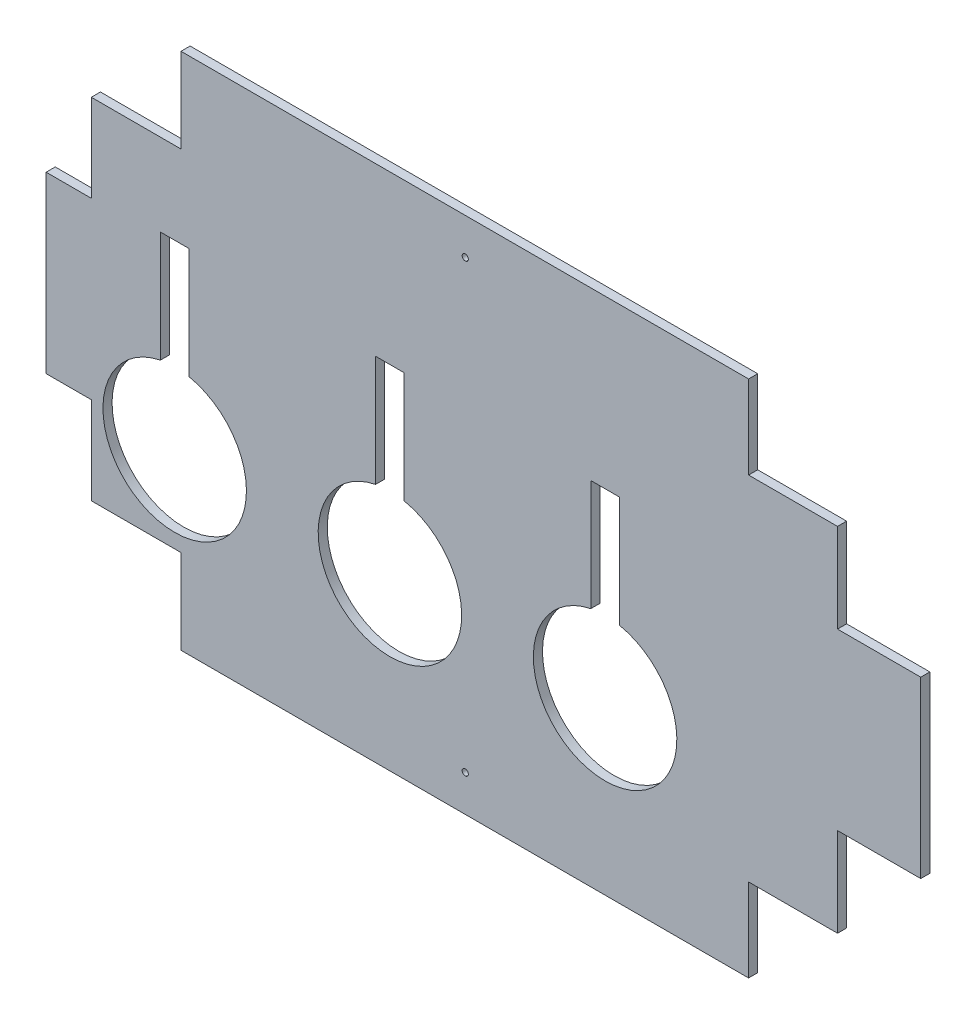
ISO-10303-21;
HEADER;
FILE_DESCRIPTION(('STEP AP214'),'2;1');
FILE_NAME('part.step','',(''),(''),'','','');
FILE_SCHEMA(('AUTOMOTIVE_DESIGN { 1 0 10303 214 1 1 1 1 }'));
ENDSEC;
DATA;
#1=APPLICATION_CONTEXT('core data for automotive mechanical design processes');
#2=APPLICATION_PROTOCOL_DEFINITION('international standard','automotive_design',2000,#1);
#3=PRODUCT_CONTEXT('',#1,'mechanical');
#4=PRODUCT('Part','Part','',(#3));
#5=PRODUCT_RELATED_PRODUCT_CATEGORY('part','',(#4));
#6=PRODUCT_DEFINITION_FORMATION('','',#4);
#7=PRODUCT_DEFINITION_CONTEXT('part definition',#1,'design');
#8=PRODUCT_DEFINITION('design','',#6,#7);
#9=PRODUCT_DEFINITION_SHAPE('','',#8);
#10=(LENGTH_UNIT() NAMED_UNIT(*) SI_UNIT(.MILLI.,.METRE.));
#11=(NAMED_UNIT(*) PLANE_ANGLE_UNIT() SI_UNIT($,.RADIAN.));
#12=(NAMED_UNIT(*) SI_UNIT($,.STERADIAN.) SOLID_ANGLE_UNIT());
#13=UNCERTAINTY_MEASURE_WITH_UNIT(LENGTH_MEASURE(1.E-05),#10,'distance_accuracy_value','');
#14=(GEOMETRIC_REPRESENTATION_CONTEXT(3) GLOBAL_UNCERTAINTY_ASSIGNED_CONTEXT((#13)) GLOBAL_UNIT_ASSIGNED_CONTEXT((#10,
#11,#12)) REPRESENTATION_CONTEXT('',''));
#15=CARTESIAN_POINT('',(0.,0.,0.));
#16=DIRECTION('',(0.,0.,1.));
#17=DIRECTION('',(1.,0.,0.));
#18=AXIS2_PLACEMENT_3D('',#15,#16,#17);
#19=CARTESIAN_POINT('',(914.4,-180.8,3.175));
#20=DIRECTION('',(0.,1.,0.));
#21=DIRECTION('',(0.,0.,1.));
#22=AXIS2_PLACEMENT_3D('',#19,#20,#21);
#23=PLANE('',#22);
#24=DIRECTION('',(0.,0.,1.));
#25=VECTOR('',#24,1.);
#26=CARTESIAN_POINT('',(398.8,-180.8,-3.175));
#27=LINE('',#26,#25);
#28=CARTESIAN_POINT('',(398.8,-180.8,-3.175));
#29=VERTEX_POINT('',#28);
#30=CARTESIAN_POINT('',(398.8,-180.8,3.175));
#31=VERTEX_POINT('',#30);
#32=EDGE_CURVE('E278',#29,#31,#27,.T.);
#33=ORIENTED_EDGE('',*,*,#32,.F.);
#34=DIRECTION('',(-1.,0.,0.));
#35=VECTOR('',#34,1.);
#36=CARTESIAN_POINT('',(914.4,-180.8,-3.175));
#37=LINE('',#36,#35);
#38=CARTESIAN_POINT('',(794.4,-180.8,-3.175));
#39=VERTEX_POINT('',#38);
#40=EDGE_CURVE('E477',#39,#29,#37,.T.);
#41=ORIENTED_EDGE('',*,*,#40,.F.);
#42=DIRECTION('',(0.,0.,1.));
#43=VECTOR('',#42,1.);
#44=CARTESIAN_POINT('',(794.4,-180.8,-3.175));
#45=LINE('',#44,#43);
#46=CARTESIAN_POINT('',(794.4,-180.8,3.175));
#47=VERTEX_POINT('',#46);
#48=EDGE_CURVE('E313',#39,#47,#45,.T.);
#49=ORIENTED_EDGE('',*,*,#48,.T.);
#50=DIRECTION('',(-1.,0.,0.));
#51=VECTOR('',#50,1.);
#52=CARTESIAN_POINT('',(914.4,-180.8,3.175));
#53=LINE('',#52,#51);
#54=EDGE_CURVE('E464',#47,#31,#53,.T.);
#55=ORIENTED_EDGE('',*,*,#54,.T.);
#56=EDGE_LOOP('',(#33,#41,#49,#55));
#57=FACE_BOUND('',#56,.T.);
#58=ADVANCED_FACE('F34',(#57),#23,.F.);
#59=CARTESIAN_POINT('',(609.6,0.,3.175));
#60=DIRECTION('',(0.,0.,1.));
#61=DIRECTION('',(-1.,0.,0.));
#62=AXIS2_PLACEMENT_3D('',#59,#60,#61);
#63=PLANE('',#62);
#64=CARTESIAN_POINT('',(596.9,-155.4,3.175));
#65=DIRECTION('',(0.,0.,-1.));
#66=DIRECTION('',(-1.,0.,0.));
#67=AXIS2_PLACEMENT_3D('',#64,#65,#66);
#68=CIRCLE('',#67,2.15264999999999);
#69=CARTESIAN_POINT('',(594.74735,-155.4,3.175));
#70=VERTEX_POINT('',#69);
#71=EDGE_CURVE('E310',#70,#70,#68,.T.);
#72=ORIENTED_EDGE('',*,*,#71,.T.);
#73=EDGE_LOOP('',(#72));
#74=FACE_BOUND('',#73,.T.);
#75=CARTESIAN_POINT('',(596.9,155.399999999999,3.175));
#76=DIRECTION('',(0.,0.,-1.));
#77=DIRECTION('',(-1.,0.,0.));
#78=AXIS2_PLACEMENT_3D('',#75,#76,#77);
#79=CIRCLE('',#78,2.15264999999999);
#80=CARTESIAN_POINT('',(594.74735,155.399999999999,3.175));
#81=VERTEX_POINT('',#80);
#82=EDGE_CURVE('E323',#81,#81,#79,.T.);
#83=ORIENTED_EDGE('',*,*,#82,.T.);
#84=EDGE_LOOP('',(#83));
#85=FACE_BOUND('',#84,.T.);
#86=CARTESIAN_POINT('',(544.4,-61.8500000000001,3.175));
#87=DIRECTION('',(0.,0.,-1.));
#88=DIRECTION('',(-1.,0.,0.));
#89=AXIS2_PLACEMENT_3D('',#86,#87,#88);
#90=CIRCLE('',#89,50.);
#91=CARTESIAN_POINT('',(554.4,-12.8602051443365,3.175));
#92=VERTEX_POINT('',#91);
#93=CARTESIAN_POINT('',(534.4,-12.8602051443365,3.175));
#94=VERTEX_POINT('',#93);
#95=EDGE_CURVE('E423',#92,#94,#90,.T.);
#96=ORIENTED_EDGE('',*,*,#95,.T.);
#97=DIRECTION('',(0.,1.,0.));
#98=VECTOR('',#97,1.);
#99=CARTESIAN_POINT('',(534.4,-12.8602051443365,3.175));
#100=LINE('',#99,#98);
#101=CARTESIAN_POINT('',(534.4,64.5097948556635,3.175));
#102=VERTEX_POINT('',#101);
#103=EDGE_CURVE('E390',#94,#102,#100,.T.);
#104=ORIENTED_EDGE('',*,*,#103,.T.);
#105=DIRECTION('',(1.,0.,0.));
#106=VECTOR('',#105,1.);
#107=CARTESIAN_POINT('',(554.4,64.5097948556635,3.175));
#108=LINE('',#107,#106);
#109=CARTESIAN_POINT('',(554.4,64.5097948556635,3.175));
#110=VERTEX_POINT('',#109);
#111=EDGE_CURVE('E407',#102,#110,#108,.T.);
#112=ORIENTED_EDGE('',*,*,#111,.T.);
#113=DIRECTION('',(0.,-1.,0.));
#114=VECTOR('',#113,1.);
#115=CARTESIAN_POINT('',(554.4,-12.8602051443365,3.175));
#116=LINE('',#115,#114);
#117=EDGE_CURVE('E415',#110,#92,#116,.T.);
#118=ORIENTED_EDGE('',*,*,#117,.T.);
#119=EDGE_LOOP('',(#96,#104,#112,#118));
#120=FACE_BOUND('',#119,.T.);
#121=CARTESIAN_POINT('',(694.4,-61.8500000000001,3.175));
#122=DIRECTION('',(0.,0.,-1.));
#123=DIRECTION('',(-1.,0.,0.));
#124=AXIS2_PLACEMENT_3D('',#121,#122,#123);
#125=CIRCLE('',#124,50.);
#126=CARTESIAN_POINT('',(704.4,-12.8602051443366,3.175));
#127=VERTEX_POINT('',#126);
#128=CARTESIAN_POINT('',(684.4,-12.8602051443365,3.175));
#129=VERTEX_POINT('',#128);
#130=EDGE_CURVE('E429',#127,#129,#125,.T.);
#131=ORIENTED_EDGE('',*,*,#130,.T.);
#132=DIRECTION('',(0.,1.,0.));
#133=VECTOR('',#132,1.);
#134=CARTESIAN_POINT('',(684.4,-12.8602051443365,3.175));
#135=LINE('',#134,#133);
#136=CARTESIAN_POINT('',(684.4,64.5097948556635,3.175));
#137=VERTEX_POINT('',#136);
#138=EDGE_CURVE('E446',#129,#137,#135,.T.);
#139=ORIENTED_EDGE('',*,*,#138,.T.);
#140=DIRECTION('',(1.,0.,0.));
#141=VECTOR('',#140,1.);
#142=CARTESIAN_POINT('',(704.4,64.5097948556635,3.175));
#143=LINE('',#142,#141);
#144=CARTESIAN_POINT('',(704.4,64.5097948556635,3.175));
#145=VERTEX_POINT('',#144);
#146=EDGE_CURVE('E449',#137,#145,#143,.T.);
#147=ORIENTED_EDGE('',*,*,#146,.T.);
#148=DIRECTION('',(0.,-1.,0.));
#149=VECTOR('',#148,1.);
#150=CARTESIAN_POINT('',(704.4,-12.8602051443366,3.175));
#151=LINE('',#150,#149);
#152=EDGE_CURVE('E434',#145,#127,#151,.T.);
#153=ORIENTED_EDGE('',*,*,#152,.T.);
#154=EDGE_LOOP('',(#131,#139,#147,#153));
#155=FACE_BOUND('',#154,.T.);
#156=CARTESIAN_POINT('',(394.4,-61.85,3.175));
#157=DIRECTION('',(0.,0.,-1.));
#158=DIRECTION('',(-1.,0.,0.));
#159=AXIS2_PLACEMENT_3D('',#156,#157,#158);
#160=CIRCLE('',#159,50.);
#161=CARTESIAN_POINT('',(404.4,-12.8602051443365,3.175));
#162=VERTEX_POINT('',#161);
#163=CARTESIAN_POINT('',(384.4,-12.8602051443365,3.175));
#164=VERTEX_POINT('',#163);
#165=EDGE_CURVE('E474',#162,#164,#160,.T.);
#166=ORIENTED_EDGE('',*,*,#165,.T.);
#167=DIRECTION('',(0.,1.,0.));
#168=VECTOR('',#167,1.);
#169=CARTESIAN_POINT('',(384.4,-12.8602051443365,3.175));
#170=LINE('',#169,#168);
#171=CARTESIAN_POINT('',(384.4,64.5097948556635,3.175));
#172=VERTEX_POINT('',#171);
#173=EDGE_CURVE('E492',#164,#172,#170,.T.);
#174=ORIENTED_EDGE('',*,*,#173,.T.);
#175=DIRECTION('',(1.,0.,0.));
#176=VECTOR('',#175,1.);
#177=CARTESIAN_POINT('',(404.4,64.5097948556635,3.175));
#178=LINE('',#177,#176);
#179=CARTESIAN_POINT('',(404.4,64.5097948556635,3.175));
#180=VERTEX_POINT('',#179);
#181=EDGE_CURVE('E489',#172,#180,#178,.T.);
#182=ORIENTED_EDGE('',*,*,#181,.T.);
#183=DIRECTION('',(0.,-1.,0.));
#184=VECTOR('',#183,1.);
#185=CARTESIAN_POINT('',(404.4,-12.8602051443365,3.175));
#186=LINE('',#185,#184);
#187=EDGE_CURVE('E486',#180,#162,#186,.T.);
#188=ORIENTED_EDGE('',*,*,#187,.T.);
#189=EDGE_LOOP('',(#166,#174,#182,#188));
#190=FACE_BOUND('',#189,.T.);
#191=ORIENTED_EDGE('',*,*,#54,.F.);
#192=DIRECTION('',(0.,-1.,0.));
#193=VECTOR('',#192,1.);
#194=CARTESIAN_POINT('',(794.4,-180.8,3.175));
#195=LINE('',#194,#193);
#196=CARTESIAN_POINT('',(794.4,-122.8,3.175));
#197=VERTEX_POINT('',#196);
#198=EDGE_CURVE('E304',#197,#47,#195,.T.);
#199=ORIENTED_EDGE('',*,*,#198,.F.);
#200=DIRECTION('',(-1.,0.,0.));
#201=VECTOR('',#200,1.);
#202=CARTESIAN_POINT('',(794.4,-122.8,3.175));
#203=LINE('',#202,#201);
#204=CARTESIAN_POINT('',(856.4,-122.8,3.175));
#205=VERTEX_POINT('',#204);
#206=EDGE_CURVE('E290',#205,#197,#203,.T.);
#207=ORIENTED_EDGE('',*,*,#206,.F.);
#208=DIRECTION('',(0.,-1.,0.));
#209=VECTOR('',#208,1.);
#210=CARTESIAN_POINT('',(856.4,-60.8000000000002,3.175));
#211=LINE('',#210,#209);
#212=CARTESIAN_POINT('',(856.4,-60.8000000000002,3.175));
#213=VERTEX_POINT('',#212);
#214=EDGE_CURVE('E281',#213,#205,#211,.T.);
#215=ORIENTED_EDGE('',*,*,#214,.F.);
#216=DIRECTION('',(-1.,0.,0.));
#217=VECTOR('',#216,1.);
#218=CARTESIAN_POINT('',(914.4,-60.8000000000002,3.175));
#219=LINE('',#218,#217);
#220=CARTESIAN_POINT('',(914.4,-60.8000000000002,3.175));
#221=VERTEX_POINT('',#220);
#222=EDGE_CURVE('E301',#221,#213,#219,.T.);
#223=ORIENTED_EDGE('',*,*,#222,.F.);
#224=DIRECTION('',(0.,-1.,0.));
#225=VECTOR('',#224,1.);
#226=CARTESIAN_POINT('',(914.4,180.8,3.175));
#227=LINE('',#226,#225);
#228=CARTESIAN_POINT('',(914.4,60.7999999999999,3.175));
#229=VERTEX_POINT('',#228);
#230=EDGE_CURVE('E462',#229,#221,#227,.T.);
#231=ORIENTED_EDGE('',*,*,#230,.F.);
#232=DIRECTION('',(-1.,0.,0.));
#233=VECTOR('',#232,1.);
#234=CARTESIAN_POINT('',(914.4,60.7999999999999,3.175));
#235=LINE('',#234,#233);
#236=CARTESIAN_POINT('',(856.4,60.7999999999999,3.175));
#237=VERTEX_POINT('',#236);
#238=EDGE_CURVE('E368',#229,#237,#235,.T.);
#239=ORIENTED_EDGE('',*,*,#238,.T.);
#240=DIRECTION('',(0.,1.,0.));
#241=VECTOR('',#240,1.);
#242=CARTESIAN_POINT('',(856.4,60.7999999999999,3.175));
#243=LINE('',#242,#241);
#244=CARTESIAN_POINT('',(856.4,122.8,3.175));
#245=VERTEX_POINT('',#244);
#246=EDGE_CURVE('E356',#237,#245,#243,.T.);
#247=ORIENTED_EDGE('',*,*,#246,.T.);
#248=DIRECTION('',(-1.,0.,0.));
#249=VECTOR('',#248,1.);
#250=CARTESIAN_POINT('',(794.4,122.8,3.175));
#251=LINE('',#250,#249);
#252=CARTESIAN_POINT('',(794.4,122.8,3.175));
#253=VERTEX_POINT('',#252);
#254=EDGE_CURVE('E380',#245,#253,#251,.T.);
#255=ORIENTED_EDGE('',*,*,#254,.T.);
#256=DIRECTION('',(0.,1.,0.));
#257=VECTOR('',#256,1.);
#258=CARTESIAN_POINT('',(794.4,180.8,3.175));
#259=LINE('',#258,#257);
#260=CARTESIAN_POINT('',(794.4,180.8,3.175));
#261=VERTEX_POINT('',#260);
#262=EDGE_CURVE('E383',#253,#261,#259,.T.);
#263=ORIENTED_EDGE('',*,*,#262,.T.);
#264=DIRECTION('',(1.,0.,0.));
#265=VECTOR('',#264,1.);
#266=CARTESIAN_POINT('',(914.4,180.8,3.175));
#267=LINE('',#266,#265);
#268=CARTESIAN_POINT('',(398.8,180.8,3.175));
#269=VERTEX_POINT('',#268);
#270=EDGE_CURVE('E471',#269,#261,#267,.T.);
#271=ORIENTED_EDGE('',*,*,#270,.F.);
#272=DIRECTION('',(0.,-1.,0.));
#273=VECTOR('',#272,1.);
#274=CARTESIAN_POINT('',(398.8,180.8,3.175));
#275=LINE('',#274,#273);
#276=CARTESIAN_POINT('',(398.8,121.8,3.175));
#277=VERTEX_POINT('',#276);
#278=EDGE_CURVE('E329',#269,#277,#275,.T.);
#279=ORIENTED_EDGE('',*,*,#278,.T.);
#280=DIRECTION('',(-1.,0.,0.));
#281=VECTOR('',#280,1.);
#282=CARTESIAN_POINT('',(336.3,121.8,3.175));
#283=LINE('',#282,#281);
#284=CARTESIAN_POINT('',(336.3,121.8,3.175));
#285=VERTEX_POINT('',#284);
#286=EDGE_CURVE('E346',#277,#285,#283,.T.);
#287=ORIENTED_EDGE('',*,*,#286,.T.);
#288=DIRECTION('',(0.,-1.,0.));
#289=VECTOR('',#288,1.);
#290=CARTESIAN_POINT('',(336.3,121.8,3.175));
#291=LINE('',#290,#289);
#292=CARTESIAN_POINT('',(336.3,60.8,3.175));
#293=VERTEX_POINT('',#292);
#294=EDGE_CURVE('E349',#285,#293,#291,.T.);
#295=ORIENTED_EDGE('',*,*,#294,.T.);
#296=DIRECTION('',(-1.,0.,0.));
#297=VECTOR('',#296,1.);
#298=CARTESIAN_POINT('',(336.3,60.8,3.175));
#299=LINE('',#298,#297);
#300=CARTESIAN_POINT('',(304.8,60.8,3.175));
#301=VERTEX_POINT('',#300);
#302=EDGE_CURVE('E334',#293,#301,#299,.T.);
#303=ORIENTED_EDGE('',*,*,#302,.T.);
#304=DIRECTION('',(0.,1.,0.));
#305=VECTOR('',#304,1.);
#306=CARTESIAN_POINT('',(304.8,180.8,3.175));
#307=LINE('',#306,#305);
#308=CARTESIAN_POINT('',(304.8,-60.8,3.175));
#309=VERTEX_POINT('',#308);
#310=EDGE_CURVE('E468',#309,#301,#307,.T.);
#311=ORIENTED_EDGE('',*,*,#310,.F.);
#312=DIRECTION('',(-1.,0.,0.));
#313=VECTOR('',#312,1.);
#314=CARTESIAN_POINT('',(336.3,-60.8000000000001,3.175));
#315=LINE('',#314,#313);
#316=CARTESIAN_POINT('',(336.3,-60.8000000000001,3.175));
#317=VERTEX_POINT('',#316);
#318=EDGE_CURVE('E270',#317,#309,#315,.T.);
#319=ORIENTED_EDGE('',*,*,#318,.F.);
#320=DIRECTION('',(0.,1.,0.));
#321=VECTOR('',#320,1.);
#322=CARTESIAN_POINT('',(336.3,-121.8,3.175));
#323=LINE('',#322,#321);
#324=CARTESIAN_POINT('',(336.3,-121.8,3.175));
#325=VERTEX_POINT('',#324);
#326=EDGE_CURVE('E250',#325,#317,#323,.T.);
#327=ORIENTED_EDGE('',*,*,#326,.F.);
#328=DIRECTION('',(-1.,0.,0.));
#329=VECTOR('',#328,1.);
#330=CARTESIAN_POINT('',(336.3,-121.8,3.175));
#331=LINE('',#330,#329);
#332=CARTESIAN_POINT('',(398.8,-121.8,3.175));
#333=VERTEX_POINT('',#332);
#334=EDGE_CURVE('E273',#333,#325,#331,.T.);
#335=ORIENTED_EDGE('',*,*,#334,.F.);
#336=DIRECTION('',(0.,1.,0.));
#337=VECTOR('',#336,1.);
#338=CARTESIAN_POINT('',(398.8,-180.8,3.175));
#339=LINE('',#338,#337);
#340=EDGE_CURVE('E259',#31,#333,#339,.T.);
#341=ORIENTED_EDGE('',*,*,#340,.F.);
#342=EDGE_LOOP('',(#191,#199,#207,#215,#223,#231,#239,#247,#255,#263,#271,#279,#287,#295,#303,
#311,#319,#327,#335,#341));
#343=FACE_BOUND('',#342,.T.);
#344=ADVANCED_FACE('F520',(#74,#85,#120,#155,#190,#343),#63,.T.);
#345=CARTESIAN_POINT('',(609.6,0.,-3.175));
#346=DIRECTION('',(0.,0.,1.));
#347=DIRECTION('',(-1.,0.,0.));
#348=AXIS2_PLACEMENT_3D('',#345,#346,#347);
#349=PLANE('',#348);
#350=CARTESIAN_POINT('',(596.9,-155.4,-3.17499999999999));
#351=DIRECTION('',(0.,0.,-1.));
#352=DIRECTION('',(-1.,0.,0.));
#353=AXIS2_PLACEMENT_3D('',#350,#351,#352);
#354=CIRCLE('',#353,2.15264999999999);
#355=CARTESIAN_POINT('',(594.74735,-155.4,-3.17499999999999));
#356=VERTEX_POINT('',#355);
#357=EDGE_CURVE('E320',#356,#356,#354,.T.);
#358=ORIENTED_EDGE('',*,*,#357,.F.);
#359=EDGE_LOOP('',(#358));
#360=FACE_BOUND('',#359,.T.);
#361=CARTESIAN_POINT('',(596.9,155.399999999999,-3.17499999999999));
#362=DIRECTION('',(0.,0.,-1.));
#363=DIRECTION('',(-1.,0.,0.));
#364=AXIS2_PLACEMENT_3D('',#361,#362,#363);
#365=CIRCLE('',#364,2.15264999999999);
#366=CARTESIAN_POINT('',(594.74735,155.399999999999,-3.17499999999999));
#367=VERTEX_POINT('',#366);
#368=EDGE_CURVE('E326',#367,#367,#365,.T.);
#369=ORIENTED_EDGE('',*,*,#368,.F.);
#370=EDGE_LOOP('',(#369));
#371=FACE_BOUND('',#370,.T.);
#372=DIRECTION('',(0.,-1.,0.));
#373=VECTOR('',#372,1.);
#374=CARTESIAN_POINT('',(554.4,-12.8602051443365,-3.175));
#375=LINE('',#374,#373);
#376=CARTESIAN_POINT('',(554.4,64.5097948556635,-3.175));
#377=VERTEX_POINT('',#376);
#378=CARTESIAN_POINT('',(554.4,-12.8602051443365,-3.175));
#379=VERTEX_POINT('',#378);
#380=EDGE_CURVE('E420',#377,#379,#375,.T.);
#381=ORIENTED_EDGE('',*,*,#380,.F.);
#382=DIRECTION('',(1.,0.,0.));
#383=VECTOR('',#382,1.);
#384=CARTESIAN_POINT('',(554.4,64.5097948556635,-3.175));
#385=LINE('',#384,#383);
#386=CARTESIAN_POINT('',(534.4,64.5097948556635,-3.175));
#387=VERTEX_POINT('',#386);
#388=EDGE_CURVE('E412',#387,#377,#385,.T.);
#389=ORIENTED_EDGE('',*,*,#388,.F.);
#390=DIRECTION('',(0.,1.,0.));
#391=VECTOR('',#390,1.);
#392=CARTESIAN_POINT('',(534.4,-12.8602051443365,-3.175));
#393=LINE('',#392,#391);
#394=CARTESIAN_POINT('',(534.4,-12.8602051443365,-3.175));
#395=VERTEX_POINT('',#394);
#396=EDGE_CURVE('E400',#395,#387,#393,.T.);
#397=ORIENTED_EDGE('',*,*,#396,.F.);
#398=CARTESIAN_POINT('',(544.4,-61.8500000000001,-3.175));
#399=DIRECTION('',(0.,0.,-1.));
#400=DIRECTION('',(-1.,0.,0.));
#401=AXIS2_PLACEMENT_3D('',#398,#399,#400);
#402=CIRCLE('',#401,50.);
#403=EDGE_CURVE('E426',#379,#395,#402,.T.);
#404=ORIENTED_EDGE('',*,*,#403,.F.);
#405=EDGE_LOOP('',(#381,#389,#397,#404));
#406=FACE_BOUND('',#405,.T.);
#407=DIRECTION('',(0.,-1.,0.));
#408=VECTOR('',#407,1.);
#409=CARTESIAN_POINT('',(704.4,-12.8602051443366,-3.175));
#410=LINE('',#409,#408);
#411=CARTESIAN_POINT('',(704.4,64.5097948556635,-3.175));
#412=VERTEX_POINT('',#411);
#413=CARTESIAN_POINT('',(704.4,-12.8602051443366,-3.175));
#414=VERTEX_POINT('',#413);
#415=EDGE_CURVE('E440',#412,#414,#410,.T.);
#416=ORIENTED_EDGE('',*,*,#415,.F.);
#417=DIRECTION('',(1.,0.,0.));
#418=VECTOR('',#417,1.);
#419=CARTESIAN_POINT('',(704.4,64.5097948556635,-3.175));
#420=LINE('',#419,#418);
#421=CARTESIAN_POINT('',(684.4,64.5097948556635,-3.175));
#422=VERTEX_POINT('',#421);
#423=EDGE_CURVE('E437',#422,#412,#420,.T.);
#424=ORIENTED_EDGE('',*,*,#423,.F.);
#425=DIRECTION('',(0.,1.,0.));
#426=VECTOR('',#425,1.);
#427=CARTESIAN_POINT('',(684.4,-12.8602051443365,-3.175));
#428=LINE('',#427,#426);
#429=CARTESIAN_POINT('',(684.4,-12.8602051443365,-3.175));
#430=VERTEX_POINT('',#429);
#431=EDGE_CURVE('E433',#430,#422,#428,.T.);
#432=ORIENTED_EDGE('',*,*,#431,.F.);
#433=CARTESIAN_POINT('',(694.4,-61.8500000000001,-3.175));
#434=DIRECTION('',(0.,0.,-1.));
#435=DIRECTION('',(-1.,0.,0.));
#436=AXIS2_PLACEMENT_3D('',#433,#434,#435);
#437=CIRCLE('',#436,50.);
#438=EDGE_CURVE('E430',#414,#430,#437,.T.);
#439=ORIENTED_EDGE('',*,*,#438,.F.);
#440=EDGE_LOOP('',(#416,#424,#432,#439));
#441=FACE_BOUND('',#440,.T.);
#442=CARTESIAN_POINT('',(394.4,-61.85,-3.175));
#443=DIRECTION('',(0.,0.,-1.));
#444=DIRECTION('',(-1.,0.,0.));
#445=AXIS2_PLACEMENT_3D('',#442,#443,#444);
#446=CIRCLE('',#445,50.);
#447=CARTESIAN_POINT('',(404.4,-12.8602051443365,-3.175));
#448=VERTEX_POINT('',#447);
#449=CARTESIAN_POINT('',(384.4,-12.8602051443365,-3.175));
#450=VERTEX_POINT('',#449);
#451=EDGE_CURVE('E495',#448,#450,#446,.T.);
#452=ORIENTED_EDGE('',*,*,#451,.F.);
#453=DIRECTION('',(0.,-1.,0.));
#454=VECTOR('',#453,1.);
#455=CARTESIAN_POINT('',(404.4,-12.8602051443365,-3.175));
#456=LINE('',#455,#454);
#457=CARTESIAN_POINT('',(404.4,64.5097948556635,-3.175));
#458=VERTEX_POINT('',#457);
#459=EDGE_CURVE('E504',#458,#448,#456,.T.);
#460=ORIENTED_EDGE('',*,*,#459,.F.);
#461=DIRECTION('',(1.,0.,0.));
#462=VECTOR('',#461,1.);
#463=CARTESIAN_POINT('',(404.4,64.5097948556635,-3.175));
#464=LINE('',#463,#462);
#465=CARTESIAN_POINT('',(384.4,64.5097948556635,-3.175));
#466=VERTEX_POINT('',#465);
#467=EDGE_CURVE('E501',#466,#458,#464,.T.);
#468=ORIENTED_EDGE('',*,*,#467,.F.);
#469=DIRECTION('',(0.,1.,0.));
#470=VECTOR('',#469,1.);
#471=CARTESIAN_POINT('',(384.4,-12.8602051443365,-3.175));
#472=LINE('',#471,#470);
#473=EDGE_CURVE('E498',#450,#466,#472,.T.);
#474=ORIENTED_EDGE('',*,*,#473,.F.);
#475=EDGE_LOOP('',(#452,#460,#468,#474));
#476=FACE_BOUND('',#475,.T.);
#477=DIRECTION('',(0.,1.,0.));
#478=VECTOR('',#477,1.);
#479=CARTESIAN_POINT('',(398.8,-180.8,-3.175));
#480=LINE('',#479,#478);
#481=CARTESIAN_POINT('',(398.8,-121.8,-3.175));
#482=VERTEX_POINT('',#481);
#483=EDGE_CURVE('E266',#29,#482,#480,.T.);
#484=ORIENTED_EDGE('',*,*,#483,.T.);
#485=DIRECTION('',(-1.,0.,0.));
#486=VECTOR('',#485,1.);
#487=CARTESIAN_POINT('',(336.3,-121.8,-3.175));
#488=LINE('',#487,#486);
#489=CARTESIAN_POINT('',(336.3,-121.8,-3.175));
#490=VERTEX_POINT('',#489);
#491=EDGE_CURVE('E264',#482,#490,#488,.T.);
#492=ORIENTED_EDGE('',*,*,#491,.T.);
#493=DIRECTION('',(0.,1.,0.));
#494=VECTOR('',#493,1.);
#495=CARTESIAN_POINT('',(336.3,-121.8,-3.175));
#496=LINE('',#495,#494);
#497=CARTESIAN_POINT('',(336.3,-60.8000000000001,-3.175));
#498=VERTEX_POINT('',#497);
#499=EDGE_CURVE('E247',#490,#498,#496,.T.);
#500=ORIENTED_EDGE('',*,*,#499,.T.);
#501=DIRECTION('',(-1.,0.,0.));
#502=VECTOR('',#501,1.);
#503=CARTESIAN_POINT('',(336.3,-60.8000000000001,-3.175));
#504=LINE('',#503,#502);
#505=CARTESIAN_POINT('',(304.8,-60.8,-3.175));
#506=VERTEX_POINT('',#505);
#507=EDGE_CURVE('E255',#498,#506,#504,.T.);
#508=ORIENTED_EDGE('',*,*,#507,.T.);
#509=DIRECTION('',(0.,1.,0.));
#510=VECTOR('',#509,1.);
#511=CARTESIAN_POINT('',(304.8,180.8,-3.175));
#512=LINE('',#511,#510);
#513=CARTESIAN_POINT('',(304.8,60.8,-3.175));
#514=VERTEX_POINT('',#513);
#515=EDGE_CURVE('E480',#506,#514,#512,.T.);
#516=ORIENTED_EDGE('',*,*,#515,.T.);
#517=DIRECTION('',(-1.,0.,0.));
#518=VECTOR('',#517,1.);
#519=CARTESIAN_POINT('',(336.3,60.8,-3.175));
#520=LINE('',#519,#518);
#521=CARTESIAN_POINT('',(336.3,60.8,-3.175));
#522=VERTEX_POINT('',#521);
#523=EDGE_CURVE('E340',#522,#514,#520,.T.);
#524=ORIENTED_EDGE('',*,*,#523,.F.);
#525=DIRECTION('',(0.,-1.,0.));
#526=VECTOR('',#525,1.);
#527=CARTESIAN_POINT('',(336.3,121.8,-3.175));
#528=LINE('',#527,#526);
#529=CARTESIAN_POINT('',(336.3,121.8,-3.175));
#530=VERTEX_POINT('',#529);
#531=EDGE_CURVE('E337',#530,#522,#528,.T.);
#532=ORIENTED_EDGE('',*,*,#531,.F.);
#533=DIRECTION('',(-1.,0.,0.));
#534=VECTOR('',#533,1.);
#535=CARTESIAN_POINT('',(336.3,121.8,-3.175));
#536=LINE('',#535,#534);
#537=CARTESIAN_POINT('',(398.8,121.8,-3.175));
#538=VERTEX_POINT('',#537);
#539=EDGE_CURVE('E333',#538,#530,#536,.T.);
#540=ORIENTED_EDGE('',*,*,#539,.F.);
#541=DIRECTION('',(0.,-1.,0.));
#542=VECTOR('',#541,1.);
#543=CARTESIAN_POINT('',(398.8,180.8,-3.175));
#544=LINE('',#543,#542);
#545=CARTESIAN_POINT('',(398.8,180.8,-3.175));
#546=VERTEX_POINT('',#545);
#547=EDGE_CURVE('E330',#546,#538,#544,.T.);
#548=ORIENTED_EDGE('',*,*,#547,.F.);
#549=DIRECTION('',(1.,0.,0.));
#550=VECTOR('',#549,1.);
#551=CARTESIAN_POINT('',(914.4,180.8,-3.175));
#552=LINE('',#551,#550);
#553=CARTESIAN_POINT('',(794.4,180.8,-3.175));
#554=VERTEX_POINT('',#553);
#555=EDGE_CURVE('E465',#546,#554,#552,.T.);
#556=ORIENTED_EDGE('',*,*,#555,.T.);
#557=DIRECTION('',(0.,1.,0.));
#558=VECTOR('',#557,1.);
#559=CARTESIAN_POINT('',(794.4,180.8,-3.175));
#560=LINE('',#559,#558);
#561=CARTESIAN_POINT('',(794.4,122.8,-3.175));
#562=VERTEX_POINT('',#561);
#563=EDGE_CURVE('E371',#562,#554,#560,.T.);
#564=ORIENTED_EDGE('',*,*,#563,.F.);
#565=DIRECTION('',(-1.,0.,0.));
#566=VECTOR('',#565,1.);
#567=CARTESIAN_POINT('',(794.4,122.8,-3.175));
#568=LINE('',#567,#566);
#569=CARTESIAN_POINT('',(856.4,122.8,-3.175));
#570=VERTEX_POINT('',#569);
#571=EDGE_CURVE('E367',#570,#562,#568,.T.);
#572=ORIENTED_EDGE('',*,*,#571,.F.);
#573=DIRECTION('',(0.,1.,0.));
#574=VECTOR('',#573,1.);
#575=CARTESIAN_POINT('',(856.4,60.7999999999999,-3.175));
#576=LINE('',#575,#574);
#577=CARTESIAN_POINT('',(856.4,60.7999999999999,-3.175));
#578=VERTEX_POINT('',#577);
#579=EDGE_CURVE('E364',#578,#570,#576,.T.);
#580=ORIENTED_EDGE('',*,*,#579,.F.);
#581=DIRECTION('',(-1.,0.,0.));
#582=VECTOR('',#581,1.);
#583=CARTESIAN_POINT('',(914.4,60.7999999999999,-3.175));
#584=LINE('',#583,#582);
#585=CARTESIAN_POINT('',(914.4,60.7999999999999,-3.175));
#586=VERTEX_POINT('',#585);
#587=EDGE_CURVE('E374',#586,#578,#584,.T.);
#588=ORIENTED_EDGE('',*,*,#587,.F.);
#589=DIRECTION('',(0.,-1.,0.));
#590=VECTOR('',#589,1.);
#591=CARTESIAN_POINT('',(914.4,180.8,-3.175));
#592=LINE('',#591,#590);
#593=CARTESIAN_POINT('',(914.4,-60.8000000000002,-3.175));
#594=VERTEX_POINT('',#593);
#595=EDGE_CURVE('E456',#586,#594,#592,.T.);
#596=ORIENTED_EDGE('',*,*,#595,.T.);
#597=DIRECTION('',(-1.,0.,0.));
#598=VECTOR('',#597,1.);
#599=CARTESIAN_POINT('',(914.4,-60.8000000000002,-3.175));
#600=LINE('',#599,#598);
#601=CARTESIAN_POINT('',(856.4,-60.8000000000002,-3.175));
#602=VERTEX_POINT('',#601);
#603=EDGE_CURVE('E289',#594,#602,#600,.T.);
#604=ORIENTED_EDGE('',*,*,#603,.T.);
#605=DIRECTION('',(0.,-1.,0.));
#606=VECTOR('',#605,1.);
#607=CARTESIAN_POINT('',(856.4,-60.8000000000002,-3.175));
#608=LINE('',#607,#606);
#609=CARTESIAN_POINT('',(856.4,-122.8,-3.175));
#610=VERTEX_POINT('',#609);
#611=EDGE_CURVE('E286',#602,#610,#608,.T.);
#612=ORIENTED_EDGE('',*,*,#611,.T.);
#613=DIRECTION('',(-1.,0.,0.));
#614=VECTOR('',#613,1.);
#615=CARTESIAN_POINT('',(794.4,-122.8,-3.175));
#616=LINE('',#615,#614);
#617=CARTESIAN_POINT('',(794.4,-122.8,-3.175));
#618=VERTEX_POINT('',#617);
#619=EDGE_CURVE('E295',#610,#618,#616,.T.);
#620=ORIENTED_EDGE('',*,*,#619,.T.);
#621=DIRECTION('',(0.,-1.,0.));
#622=VECTOR('',#621,1.);
#623=CARTESIAN_POINT('',(794.4,-180.8,-3.175));
#624=LINE('',#623,#622);
#625=EDGE_CURVE('E293',#618,#39,#624,.T.);
#626=ORIENTED_EDGE('',*,*,#625,.T.);
#627=ORIENTED_EDGE('',*,*,#40,.T.);
#628=EDGE_LOOP('',(#484,#492,#500,#508,#516,#524,#532,#540,#548,#556,#564,#572,#580,#588,#596,
#604,#612,#620,#626,#627));
#629=FACE_BOUND('',#628,.T.);
#630=ADVANCED_FACE('F262',(#360,#371,#406,#441,#476,#629),#349,.F.);
#631=CARTESIAN_POINT('',(304.8,180.8,3.175));
#632=DIRECTION('',(1.,0.,0.));
#633=DIRECTION('',(0.,-1.,0.));
#634=AXIS2_PLACEMENT_3D('',#631,#632,#633);
#635=PLANE('',#634);
#636=DIRECTION('',(0.,0.,1.));
#637=VECTOR('',#636,1.);
#638=CARTESIAN_POINT('',(304.8,-60.8,-3.175));
#639=LINE('',#638,#637);
#640=EDGE_CURVE('E49',#506,#309,#639,.T.);
#641=ORIENTED_EDGE('',*,*,#640,.T.);
#642=ORIENTED_EDGE('',*,*,#310,.T.);
#643=DIRECTION('',(0.,0.,1.));
#644=VECTOR('',#643,1.);
#645=CARTESIAN_POINT('',(304.8,60.8,-3.175));
#646=LINE('',#645,#644);
#647=EDGE_CURVE('E354',#514,#301,#646,.T.);
#648=ORIENTED_EDGE('',*,*,#647,.F.);
#649=ORIENTED_EDGE('',*,*,#515,.F.);
#650=EDGE_LOOP('',(#641,#642,#648,#649));
#651=FACE_BOUND('',#650,.T.);
#652=ADVANCED_FACE('F551',(#651),#635,.F.);
#653=CARTESIAN_POINT('',(914.4,180.8,3.175));
#654=DIRECTION('',(-1.,0.,0.));
#655=DIRECTION('',(0.,1.,0.));
#656=AXIS2_PLACEMENT_3D('',#653,#654,#655);
#657=PLANE('',#656);
#658=DIRECTION('',(0.,0.,1.));
#659=VECTOR('',#658,1.);
#660=CARTESIAN_POINT('',(914.4,-60.8000000000002,-3.175));
#661=LINE('',#660,#659);
#662=EDGE_CURVE('E57',#594,#221,#661,.T.);
#663=ORIENTED_EDGE('',*,*,#662,.F.);
#664=ORIENTED_EDGE('',*,*,#595,.F.);
#665=DIRECTION('',(0.,0.,1.));
#666=VECTOR('',#665,1.);
#667=CARTESIAN_POINT('',(914.4,60.7999999999999,-3.175));
#668=LINE('',#667,#666);
#669=EDGE_CURVE('E391',#586,#229,#668,.T.);
#670=ORIENTED_EDGE('',*,*,#669,.T.);
#671=ORIENTED_EDGE('',*,*,#230,.T.);
#672=EDGE_LOOP('',(#663,#664,#670,#671));
#673=FACE_BOUND('',#672,.T.);
#674=ADVANCED_FACE('F552',(#673),#657,.F.);
#675=CARTESIAN_POINT('',(384.4,-12.8602051443365,-3.175));
#676=DIRECTION('',(-1.,0.,0.));
#677=DIRECTION('',(0.,1.,0.));
#678=AXIS2_PLACEMENT_3D('',#675,#676,#677);
#679=PLANE('',#678);
#680=ORIENTED_EDGE('',*,*,#173,.F.);
#681=DIRECTION('',(0.,0.,1.));
#682=VECTOR('',#681,1.);
#683=CARTESIAN_POINT('',(384.4,-12.8602051443365,-3.175));
#684=LINE('',#683,#682);
#685=EDGE_CURVE('E507',#450,#164,#684,.T.);
#686=ORIENTED_EDGE('',*,*,#685,.F.);
#687=ORIENTED_EDGE('',*,*,#473,.T.);
#688=DIRECTION('',(0.,0.,1.));
#689=VECTOR('',#688,1.);
#690=CARTESIAN_POINT('',(384.4,64.5097948556635,-3.175));
#691=LINE('',#690,#689);
#692=EDGE_CURVE('E11',#466,#172,#691,.T.);
#693=ORIENTED_EDGE('',*,*,#692,.T.);
#694=EDGE_LOOP('',(#680,#686,#687,#693));
#695=FACE_BOUND('',#694,.T.);
#696=ADVANCED_FACE('F36',(#695),#679,.F.);
#697=CARTESIAN_POINT('',(404.4,64.5097948556635,-3.175));
#698=DIRECTION('',(0.,1.,0.));
#699=DIRECTION('',(0.,0.,1.));
#700=AXIS2_PLACEMENT_3D('',#697,#698,#699);
#701=PLANE('',#700);
#702=ORIENTED_EDGE('',*,*,#181,.F.);
#703=ORIENTED_EDGE('',*,*,#692,.F.);
#704=ORIENTED_EDGE('',*,*,#467,.T.);
#705=DIRECTION('',(0.,0.,1.));
#706=VECTOR('',#705,1.);
#707=CARTESIAN_POINT('',(404.4,64.5097948556635,-3.175));
#708=LINE('',#707,#706);
#709=EDGE_CURVE('E42',#458,#180,#708,.T.);
#710=ORIENTED_EDGE('',*,*,#709,.T.);
#711=EDGE_LOOP('',(#702,#703,#704,#710));
#712=FACE_BOUND('',#711,.T.);
#713=ADVANCED_FACE('F513',(#712),#701,.F.);
#714=CARTESIAN_POINT('',(404.4,-12.8602051443365,-3.175));
#715=DIRECTION('',(1.,0.,0.));
#716=DIRECTION('',(0.,0.,1.));
#717=AXIS2_PLACEMENT_3D('',#714,#715,#716);
#718=PLANE('',#717);
#719=ORIENTED_EDGE('',*,*,#187,.F.);
#720=ORIENTED_EDGE('',*,*,#709,.F.);
#721=ORIENTED_EDGE('',*,*,#459,.T.);
#722=DIRECTION('',(0.,0.,1.));
#723=VECTOR('',#722,1.);
#724=CARTESIAN_POINT('',(404.4,-12.8602051443365,-3.175));
#725=LINE('',#724,#723);
#726=EDGE_CURVE('E509',#448,#162,#725,.T.);
#727=ORIENTED_EDGE('',*,*,#726,.T.);
#728=EDGE_LOOP('',(#719,#720,#721,#727));
#729=FACE_BOUND('',#728,.T.);
#730=ADVANCED_FACE('F517',(#729),#718,.F.);
#731=CARTESIAN_POINT('',(394.4,-61.85,-3.175));
#732=DIRECTION('',(0.,0.,1.));
#733=DIRECTION('',(-1.,0.,0.));
#734=AXIS2_PLACEMENT_3D('',#731,#732,#733);
#735=CYLINDRICAL_SURFACE('',#734,50.);
#736=ORIENTED_EDGE('',*,*,#165,.F.);
#737=ORIENTED_EDGE('',*,*,#726,.F.);
#738=ORIENTED_EDGE('',*,*,#451,.T.);
#739=ORIENTED_EDGE('',*,*,#685,.T.);
#740=EDGE_LOOP('',(#736,#737,#738,#739));
#741=FACE_BOUND('',#740,.T.);
#742=ADVANCED_FACE('F528',(#741),#735,.F.);
#743=CARTESIAN_POINT('',(914.4,180.8,3.175));
#744=DIRECTION('',(0.,-1.,0.));
#745=DIRECTION('',(0.,0.,-1.));
#746=AXIS2_PLACEMENT_3D('',#743,#744,#745);
#747=PLANE('',#746);
#748=ORIENTED_EDGE('',*,*,#270,.T.);
#749=DIRECTION('',(0.,0.,1.));
#750=VECTOR('',#749,1.);
#751=CARTESIAN_POINT('',(794.4,180.8,-3.175));
#752=LINE('',#751,#750);
#753=EDGE_CURVE('E393',#554,#261,#752,.T.);
#754=ORIENTED_EDGE('',*,*,#753,.F.);
#755=ORIENTED_EDGE('',*,*,#555,.F.);
#756=DIRECTION('',(0.,0.,1.));
#757=VECTOR('',#756,1.);
#758=CARTESIAN_POINT('',(398.8,180.8,-3.175));
#759=LINE('',#758,#757);
#760=EDGE_CURVE('E343',#546,#269,#759,.T.);
#761=ORIENTED_EDGE('',*,*,#760,.T.);
#762=EDGE_LOOP('',(#748,#754,#755,#761));
#763=FACE_BOUND('',#762,.T.);
#764=ADVANCED_FACE('F530',(#763),#747,.F.);
#765=CARTESIAN_POINT('',(694.4,-61.8500000000001,-3.175));
#766=DIRECTION('',(0.,0.,1.));
#767=DIRECTION('',(-1.,0.,0.));
#768=AXIS2_PLACEMENT_3D('',#765,#766,#767);
#769=CYLINDRICAL_SURFACE('',#768,50.);
#770=ORIENTED_EDGE('',*,*,#130,.F.);
#771=DIRECTION('',(0.,0.,1.));
#772=VECTOR('',#771,1.);
#773=CARTESIAN_POINT('',(704.4,-12.8602051443366,-3.175));
#774=LINE('',#773,#772);
#775=EDGE_CURVE('E454',#414,#127,#774,.T.);
#776=ORIENTED_EDGE('',*,*,#775,.F.);
#777=ORIENTED_EDGE('',*,*,#438,.T.);
#778=DIRECTION('',(0.,0.,1.));
#779=VECTOR('',#778,1.);
#780=CARTESIAN_POINT('',(684.4,-12.8602051443365,-3.175));
#781=LINE('',#780,#779);
#782=EDGE_CURVE('E443',#430,#129,#781,.T.);
#783=ORIENTED_EDGE('',*,*,#782,.T.);
#784=EDGE_LOOP('',(#770,#776,#777,#783));
#785=FACE_BOUND('',#784,.T.);
#786=ADVANCED_FACE('F536',(#785),#769,.F.);
#787=CARTESIAN_POINT('',(704.4,-12.8602051443366,-3.175));
#788=DIRECTION('',(1.,0.,0.));
#789=DIRECTION('',(0.,0.,1.));
#790=AXIS2_PLACEMENT_3D('',#787,#788,#789);
#791=PLANE('',#790);
#792=ORIENTED_EDGE('',*,*,#152,.F.);
#793=DIRECTION('',(0.,0.,1.));
#794=VECTOR('',#793,1.);
#795=CARTESIAN_POINT('',(704.4,64.5097948556635,-3.175));
#796=LINE('',#795,#794);
#797=EDGE_CURVE('E457',#412,#145,#796,.T.);
#798=ORIENTED_EDGE('',*,*,#797,.F.);
#799=ORIENTED_EDGE('',*,*,#415,.T.);
#800=ORIENTED_EDGE('',*,*,#775,.T.);
#801=EDGE_LOOP('',(#792,#798,#799,#800));
#802=FACE_BOUND('',#801,.T.);
#803=ADVANCED_FACE('F683',(#802),#791,.F.);
#804=CARTESIAN_POINT('',(704.4,64.5097948556635,-3.175));
#805=DIRECTION('',(0.,1.,0.));
#806=DIRECTION('',(0.,0.,1.));
#807=AXIS2_PLACEMENT_3D('',#804,#805,#806);
#808=PLANE('',#807);
#809=ORIENTED_EDGE('',*,*,#146,.F.);
#810=DIRECTION('',(0.,0.,1.));
#811=VECTOR('',#810,1.);
#812=CARTESIAN_POINT('',(684.4,64.5097948556635,-3.175));
#813=LINE('',#812,#811);
#814=EDGE_CURVE('E459',#422,#137,#813,.T.);
#815=ORIENTED_EDGE('',*,*,#814,.F.);
#816=ORIENTED_EDGE('',*,*,#423,.T.);
#817=ORIENTED_EDGE('',*,*,#797,.T.);
#818=EDGE_LOOP('',(#809,#815,#816,#817));
#819=FACE_BOUND('',#818,.T.);
#820=ADVANCED_FACE('F686',(#819),#808,.F.);
#821=CARTESIAN_POINT('',(684.4,-12.8602051443365,-3.175));
#822=DIRECTION('',(-1.,0.,0.));
#823=DIRECTION('',(0.,1.,0.));
#824=AXIS2_PLACEMENT_3D('',#821,#822,#823);
#825=PLANE('',#824);
#826=ORIENTED_EDGE('',*,*,#138,.F.);
#827=ORIENTED_EDGE('',*,*,#782,.F.);
#828=ORIENTED_EDGE('',*,*,#431,.T.);
#829=ORIENTED_EDGE('',*,*,#814,.T.);
#830=EDGE_LOOP('',(#826,#827,#828,#829));
#831=FACE_BOUND('',#830,.T.);
#832=ADVANCED_FACE('F681',(#831),#825,.F.);
#833=CARTESIAN_POINT('',(544.4,-61.8500000000001,-3.175));
#834=DIRECTION('',(0.,0.,1.));
#835=DIRECTION('',(-1.,0.,0.));
#836=AXIS2_PLACEMENT_3D('',#833,#834,#835);
#837=CYLINDRICAL_SURFACE('',#836,50.);
#838=ORIENTED_EDGE('',*,*,#95,.F.);
#839=DIRECTION('',(0.,0.,1.));
#840=VECTOR('',#839,1.);
#841=CARTESIAN_POINT('',(554.4,-12.8602051443365,-3.175));
#842=LINE('',#841,#840);
#843=EDGE_CURVE('E418',#379,#92,#842,.T.);
#844=ORIENTED_EDGE('',*,*,#843,.F.);
#845=ORIENTED_EDGE('',*,*,#403,.T.);
#846=DIRECTION('',(0.,0.,1.));
#847=VECTOR('',#846,1.);
#848=CARTESIAN_POINT('',(534.4,-12.8602051443365,-3.175));
#849=LINE('',#848,#847);
#850=EDGE_CURVE('E405',#395,#94,#849,.T.);
#851=ORIENTED_EDGE('',*,*,#850,.T.);
#852=EDGE_LOOP('',(#838,#844,#845,#851));
#853=FACE_BOUND('',#852,.T.);
#854=ADVANCED_FACE('F677',(#853),#837,.F.);
#855=CARTESIAN_POINT('',(554.4,-12.8602051443365,-3.175));
#856=DIRECTION('',(1.,0.,0.));
#857=DIRECTION('',(0.,0.,1.));
#858=AXIS2_PLACEMENT_3D('',#855,#856,#857);
#859=PLANE('',#858);
#860=ORIENTED_EDGE('',*,*,#117,.F.);
#861=DIRECTION('',(0.,0.,1.));
#862=VECTOR('',#861,1.);
#863=CARTESIAN_POINT('',(554.4,64.5097948556635,-3.175));
#864=LINE('',#863,#862);
#865=EDGE_CURVE('E410',#377,#110,#864,.T.);
#866=ORIENTED_EDGE('',*,*,#865,.F.);
#867=ORIENTED_EDGE('',*,*,#380,.T.);
#868=ORIENTED_EDGE('',*,*,#843,.T.);
#869=EDGE_LOOP('',(#860,#866,#867,#868));
#870=FACE_BOUND('',#869,.T.);
#871=ADVANCED_FACE('F673',(#870),#859,.F.);
#872=CARTESIAN_POINT('',(554.4,64.5097948556635,-3.175));
#873=DIRECTION('',(0.,1.,0.));
#874=DIRECTION('',(0.,0.,1.));
#875=AXIS2_PLACEMENT_3D('',#872,#873,#874);
#876=PLANE('',#875);
#877=ORIENTED_EDGE('',*,*,#111,.F.);
#878=DIRECTION('',(0.,0.,1.));
#879=VECTOR('',#878,1.);
#880=CARTESIAN_POINT('',(534.4,64.5097948556635,-3.175));
#881=LINE('',#880,#879);
#882=EDGE_CURVE('E403',#387,#102,#881,.T.);
#883=ORIENTED_EDGE('',*,*,#882,.F.);
#884=ORIENTED_EDGE('',*,*,#388,.T.);
#885=ORIENTED_EDGE('',*,*,#865,.T.);
#886=EDGE_LOOP('',(#877,#883,#884,#885));
#887=FACE_BOUND('',#886,.T.);
#888=ADVANCED_FACE('F669',(#887),#876,.F.);
#889=CARTESIAN_POINT('',(534.4,-12.8602051443365,-3.175));
#890=DIRECTION('',(-1.,0.,0.));
#891=DIRECTION('',(0.,1.,0.));
#892=AXIS2_PLACEMENT_3D('',#889,#890,#891);
#893=PLANE('',#892);
#894=ORIENTED_EDGE('',*,*,#103,.F.);
#895=ORIENTED_EDGE('',*,*,#850,.F.);
#896=ORIENTED_EDGE('',*,*,#396,.T.);
#897=ORIENTED_EDGE('',*,*,#882,.T.);
#898=EDGE_LOOP('',(#894,#895,#896,#897));
#899=FACE_BOUND('',#898,.T.);
#900=ADVANCED_FACE('F666',(#899),#893,.F.);
#901=CARTESIAN_POINT('',(856.4,60.7999999999999,-3.175));
#902=DIRECTION('',(-1.,0.,0.));
#903=DIRECTION('',(0.,0.,-1.));
#904=AXIS2_PLACEMENT_3D('',#901,#902,#903);
#905=PLANE('',#904);
#906=ORIENTED_EDGE('',*,*,#246,.F.);
#907=DIRECTION('',(0.,0.,1.));
#908=VECTOR('',#907,1.);
#909=CARTESIAN_POINT('',(856.4,60.7999999999999,-3.175));
#910=LINE('',#909,#908);
#911=EDGE_CURVE('E388',#578,#237,#910,.T.);
#912=ORIENTED_EDGE('',*,*,#911,.F.);
#913=ORIENTED_EDGE('',*,*,#579,.T.);
#914=DIRECTION('',(0.,0.,1.));
#915=VECTOR('',#914,1.);
#916=CARTESIAN_POINT('',(856.4,122.8,-3.175));
#917=LINE('',#916,#915);
#918=EDGE_CURVE('E377',#570,#245,#917,.T.);
#919=ORIENTED_EDGE('',*,*,#918,.T.);
#920=EDGE_LOOP('',(#906,#912,#913,#919));
#921=FACE_BOUND('',#920,.T.);
#922=ADVANCED_FACE('F596',(#921),#905,.F.);
#923=CARTESIAN_POINT('',(914.4,60.7999999999999,-3.175));
#924=DIRECTION('',(0.,-1.,0.));
#925=DIRECTION('',(0.,0.,-1.));
#926=AXIS2_PLACEMENT_3D('',#923,#924,#925);
#927=PLANE('',#926);
#928=ORIENTED_EDGE('',*,*,#238,.F.);
#929=ORIENTED_EDGE('',*,*,#669,.F.);
#930=ORIENTED_EDGE('',*,*,#587,.T.);
#931=ORIENTED_EDGE('',*,*,#911,.T.);
#932=EDGE_LOOP('',(#928,#929,#930,#931));
#933=FACE_BOUND('',#932,.T.);
#934=ADVANCED_FACE('F599',(#933),#927,.F.);
#935=CARTESIAN_POINT('',(794.4,180.8,-3.175));
#936=DIRECTION('',(-1.,0.,0.));
#937=DIRECTION('',(0.,0.,-1.));
#938=AXIS2_PLACEMENT_3D('',#935,#936,#937);
#939=PLANE('',#938);
#940=ORIENTED_EDGE('',*,*,#262,.F.);
#941=DIRECTION('',(0.,0.,1.));
#942=VECTOR('',#941,1.);
#943=CARTESIAN_POINT('',(794.4,122.8,-3.175));
#944=LINE('',#943,#942);
#945=EDGE_CURVE('E395',#562,#253,#944,.T.);
#946=ORIENTED_EDGE('',*,*,#945,.F.);
#947=ORIENTED_EDGE('',*,*,#563,.T.);
#948=ORIENTED_EDGE('',*,*,#753,.T.);
#949=EDGE_LOOP('',(#940,#946,#947,#948));
#950=FACE_BOUND('',#949,.T.);
#951=ADVANCED_FACE('F588',(#950),#939,.F.);
#952=CARTESIAN_POINT('',(794.4,122.8,-3.175));
#953=DIRECTION('',(0.,-1.,0.));
#954=DIRECTION('',(-1.,0.,0.));
#955=AXIS2_PLACEMENT_3D('',#952,#953,#954);
#956=PLANE('',#955);
#957=ORIENTED_EDGE('',*,*,#254,.F.);
#958=ORIENTED_EDGE('',*,*,#918,.F.);
#959=ORIENTED_EDGE('',*,*,#571,.T.);
#960=ORIENTED_EDGE('',*,*,#945,.T.);
#961=EDGE_LOOP('',(#957,#958,#959,#960));
#962=FACE_BOUND('',#961,.T.);
#963=ADVANCED_FACE('F591',(#962),#956,.F.);
#964=CARTESIAN_POINT('',(336.3,60.8,-3.175));
#965=DIRECTION('',(0.,-1.,0.));
#966=DIRECTION('',(0.,0.,-1.));
#967=AXIS2_PLACEMENT_3D('',#964,#965,#966);
#968=PLANE('',#967);
#969=ORIENTED_EDGE('',*,*,#302,.F.);
#970=DIRECTION('',(0.,0.,1.));
#971=VECTOR('',#970,1.);
#972=CARTESIAN_POINT('',(336.3,60.8,-3.175));
#973=LINE('',#972,#971);
#974=EDGE_CURVE('E357',#522,#293,#973,.T.);
#975=ORIENTED_EDGE('',*,*,#974,.F.);
#976=ORIENTED_EDGE('',*,*,#523,.T.);
#977=ORIENTED_EDGE('',*,*,#647,.T.);
#978=EDGE_LOOP('',(#969,#975,#976,#977));
#979=FACE_BOUND('',#978,.T.);
#980=ADVANCED_FACE('F569',(#979),#968,.F.);
#981=CARTESIAN_POINT('',(336.3,121.8,-3.175));
#982=DIRECTION('',(1.,0.,0.));
#983=DIRECTION('',(0.,0.,1.));
#984=AXIS2_PLACEMENT_3D('',#981,#982,#983);
#985=PLANE('',#984);
#986=ORIENTED_EDGE('',*,*,#294,.F.);
#987=DIRECTION('',(0.,0.,1.));
#988=VECTOR('',#987,1.);
#989=CARTESIAN_POINT('',(336.3,121.8,-3.175));
#990=LINE('',#989,#988);
#991=EDGE_CURVE('E359',#530,#285,#990,.T.);
#992=ORIENTED_EDGE('',*,*,#991,.F.);
#993=ORIENTED_EDGE('',*,*,#531,.T.);
#994=ORIENTED_EDGE('',*,*,#974,.T.);
#995=EDGE_LOOP('',(#986,#992,#993,#994));
#996=FACE_BOUND('',#995,.T.);
#997=ADVANCED_FACE('F575',(#996),#985,.F.);
#998=CARTESIAN_POINT('',(336.3,121.8,-3.175));
#999=DIRECTION('',(0.,-1.,0.));
#1000=DIRECTION('',(0.,0.,-1.));
#1001=AXIS2_PLACEMENT_3D('',#998,#999,#1000);
#1002=PLANE('',#1001);
#1003=ORIENTED_EDGE('',*,*,#286,.F.);
#1004=DIRECTION('',(0.,0.,1.));
#1005=VECTOR('',#1004,1.);
#1006=CARTESIAN_POINT('',(398.8,121.8,-3.175));
#1007=LINE('',#1006,#1005);
#1008=EDGE_CURVE('E361',#538,#277,#1007,.T.);
#1009=ORIENTED_EDGE('',*,*,#1008,.F.);
#1010=ORIENTED_EDGE('',*,*,#539,.T.);
#1011=ORIENTED_EDGE('',*,*,#991,.T.);
#1012=EDGE_LOOP('',(#1003,#1009,#1010,#1011));
#1013=FACE_BOUND('',#1012,.T.);
#1014=ADVANCED_FACE('F578',(#1013),#1002,.F.);
#1015=CARTESIAN_POINT('',(398.8,180.8,-3.175));
#1016=DIRECTION('',(1.,0.,0.));
#1017=DIRECTION('',(0.,0.,1.));
#1018=AXIS2_PLACEMENT_3D('',#1015,#1016,#1017);
#1019=PLANE('',#1018);
#1020=ORIENTED_EDGE('',*,*,#278,.F.);
#1021=ORIENTED_EDGE('',*,*,#760,.F.);
#1022=ORIENTED_EDGE('',*,*,#547,.T.);
#1023=ORIENTED_EDGE('',*,*,#1008,.T.);
#1024=EDGE_LOOP('',(#1020,#1021,#1022,#1023));
#1025=FACE_BOUND('',#1024,.T.);
#1026=ADVANCED_FACE('F581',(#1025),#1019,.F.);
#1027=CARTESIAN_POINT('',(596.9,155.399999999999,3.175));
#1028=DIRECTION('',(0.,0.,1.));
#1029=DIRECTION('',(-1.,0.,0.));
#1030=AXIS2_PLACEMENT_3D('',#1027,#1028,#1029);
#1031=CYLINDRICAL_SURFACE('',#1030,2.15264999999999);
#1032=ORIENTED_EDGE('',*,*,#368,.T.);
#1033=EDGE_LOOP('',(#1032));
#1034=FACE_BOUND('',#1033,.T.);
#1035=ORIENTED_EDGE('',*,*,#82,.F.);
#1036=EDGE_LOOP('',(#1035));
#1037=FACE_BOUND('',#1036,.T.);
#1038=ADVANCED_FACE('F645',(#1034,#1037),#1031,.F.);
#1039=CARTESIAN_POINT('',(596.9,-155.4,3.175));
#1040=DIRECTION('',(0.,0.,1.));
#1041=DIRECTION('',(-1.,0.,0.));
#1042=AXIS2_PLACEMENT_3D('',#1039,#1040,#1041);
#1043=CYLINDRICAL_SURFACE('',#1042,2.15264999999999);
#1044=ORIENTED_EDGE('',*,*,#357,.T.);
#1045=EDGE_LOOP('',(#1044));
#1046=FACE_BOUND('',#1045,.T.);
#1047=ORIENTED_EDGE('',*,*,#71,.F.);
#1048=EDGE_LOOP('',(#1047));
#1049=FACE_BOUND('',#1048,.T.);
#1050=ADVANCED_FACE('F642',(#1046,#1049),#1043,.F.);
#1051=CARTESIAN_POINT('',(856.4,-60.8000000000002,-3.175));
#1052=DIRECTION('',(1.,0.,0.));
#1053=DIRECTION('',(0.,0.,1.));
#1054=AXIS2_PLACEMENT_3D('',#1051,#1052,#1053);
#1055=PLANE('',#1054);
#1056=ORIENTED_EDGE('',*,*,#214,.T.);
#1057=DIRECTION('',(0.,0.,1.));
#1058=VECTOR('',#1057,1.);
#1059=CARTESIAN_POINT('',(856.4,-122.8,-3.175));
#1060=LINE('',#1059,#1058);
#1061=EDGE_CURVE('E308',#610,#205,#1060,.T.);
#1062=ORIENTED_EDGE('',*,*,#1061,.F.);
#1063=ORIENTED_EDGE('',*,*,#611,.F.);
#1064=DIRECTION('',(0.,0.,1.));
#1065=VECTOR('',#1064,1.);
#1066=CARTESIAN_POINT('',(856.4,-60.8000000000002,-3.175));
#1067=LINE('',#1066,#1065);
#1068=EDGE_CURVE('E298',#602,#213,#1067,.T.);
#1069=ORIENTED_EDGE('',*,*,#1068,.T.);
#1070=EDGE_LOOP('',(#1056,#1062,#1063,#1069));
#1071=FACE_BOUND('',#1070,.T.);
#1072=ADVANCED_FACE('F607',(#1071),#1055,.T.);
#1073=CARTESIAN_POINT('',(794.4,-122.8,-3.175));
#1074=DIRECTION('',(0.,-1.,0.));
#1075=DIRECTION('',(-1.,0.,0.));
#1076=AXIS2_PLACEMENT_3D('',#1073,#1074,#1075);
#1077=PLANE('',#1076);
#1078=ORIENTED_EDGE('',*,*,#206,.T.);
#1079=DIRECTION('',(0.,0.,1.));
#1080=VECTOR('',#1079,1.);
#1081=CARTESIAN_POINT('',(794.4,-122.8,-3.175));
#1082=LINE('',#1081,#1080);
#1083=EDGE_CURVE('E311',#618,#197,#1082,.T.);
#1084=ORIENTED_EDGE('',*,*,#1083,.F.);
#1085=ORIENTED_EDGE('',*,*,#619,.F.);
#1086=ORIENTED_EDGE('',*,*,#1061,.T.);
#1087=EDGE_LOOP('',(#1078,#1084,#1085,#1086));
#1088=FACE_BOUND('',#1087,.T.);
#1089=ADVANCED_FACE('F611',(#1088),#1077,.T.);
#1090=CARTESIAN_POINT('',(794.4,-180.8,-3.175));
#1091=DIRECTION('',(1.,0.,0.));
#1092=DIRECTION('',(0.,0.,1.));
#1093=AXIS2_PLACEMENT_3D('',#1090,#1091,#1092);
#1094=PLANE('',#1093);
#1095=ORIENTED_EDGE('',*,*,#198,.T.);
#1096=ORIENTED_EDGE('',*,*,#48,.F.);
#1097=ORIENTED_EDGE('',*,*,#625,.F.);
#1098=ORIENTED_EDGE('',*,*,#1083,.T.);
#1099=EDGE_LOOP('',(#1095,#1096,#1097,#1098));
#1100=FACE_BOUND('',#1099,.T.);
#1101=ADVANCED_FACE('F616',(#1100),#1094,.T.);
#1102=CARTESIAN_POINT('',(914.4,-60.8000000000002,-3.175));
#1103=DIRECTION('',(0.,-1.,0.));
#1104=DIRECTION('',(0.,0.,-1.));
#1105=AXIS2_PLACEMENT_3D('',#1102,#1103,#1104);
#1106=PLANE('',#1105);
#1107=ORIENTED_EDGE('',*,*,#222,.T.);
#1108=ORIENTED_EDGE('',*,*,#1068,.F.);
#1109=ORIENTED_EDGE('',*,*,#603,.F.);
#1110=ORIENTED_EDGE('',*,*,#662,.T.);
#1111=EDGE_LOOP('',(#1107,#1108,#1109,#1110));
#1112=FACE_BOUND('',#1111,.T.);
#1113=ADVANCED_FACE('F603',(#1112),#1106,.T.);
#1114=CARTESIAN_POINT('',(398.8,-180.8,-3.175));
#1115=DIRECTION('',(-1.,0.,0.));
#1116=DIRECTION('',(0.,0.,-1.));
#1117=AXIS2_PLACEMENT_3D('',#1114,#1115,#1116);
#1118=PLANE('',#1117);
#1119=ORIENTED_EDGE('',*,*,#340,.T.);
#1120=DIRECTION('',(0.,0.,1.));
#1121=VECTOR('',#1120,1.);
#1122=CARTESIAN_POINT('',(398.8,-121.8,-3.175));
#1123=LINE('',#1122,#1121);
#1124=EDGE_CURVE('E282',#482,#333,#1123,.T.);
#1125=ORIENTED_EDGE('',*,*,#1124,.F.);
#1126=ORIENTED_EDGE('',*,*,#483,.F.);
#1127=ORIENTED_EDGE('',*,*,#32,.T.);
#1128=EDGE_LOOP('',(#1119,#1125,#1126,#1127));
#1129=FACE_BOUND('',#1128,.T.);
#1130=ADVANCED_FACE('F619',(#1129),#1118,.T.);
#1131=CARTESIAN_POINT('',(336.3,-121.8,-3.175));
#1132=DIRECTION('',(0.,-1.,0.));
#1133=DIRECTION('',(0.,0.,-1.));
#1134=AXIS2_PLACEMENT_3D('',#1131,#1132,#1133);
#1135=PLANE('',#1134);
#1136=ORIENTED_EDGE('',*,*,#334,.T.);
#1137=DIRECTION('',(0.,0.,1.));
#1138=VECTOR('',#1137,1.);
#1139=CARTESIAN_POINT('',(336.3,-121.8,-3.175));
#1140=LINE('',#1139,#1138);
#1141=EDGE_CURVE('E252',#490,#325,#1140,.T.);
#1142=ORIENTED_EDGE('',*,*,#1141,.F.);
#1143=ORIENTED_EDGE('',*,*,#491,.F.);
#1144=ORIENTED_EDGE('',*,*,#1124,.T.);
#1145=EDGE_LOOP('',(#1136,#1142,#1143,#1144));
#1146=FACE_BOUND('',#1145,.T.);
#1147=ADVANCED_FACE('F622',(#1146),#1135,.T.);
#1148=CARTESIAN_POINT('',(336.3,-121.8,-3.175));
#1149=DIRECTION('',(-1.,0.,0.));
#1150=DIRECTION('',(0.,0.,-1.));
#1151=AXIS2_PLACEMENT_3D('',#1148,#1149,#1150);
#1152=PLANE('',#1151);
#1153=ORIENTED_EDGE('',*,*,#326,.T.);
#1154=DIRECTION('',(0.,0.,1.));
#1155=VECTOR('',#1154,1.);
#1156=CARTESIAN_POINT('',(336.3,-60.8000000000001,-3.175));
#1157=LINE('',#1156,#1155);
#1158=EDGE_CURVE('E244',#498,#317,#1157,.T.);
#1159=ORIENTED_EDGE('',*,*,#1158,.F.);
#1160=ORIENTED_EDGE('',*,*,#499,.F.);
#1161=ORIENTED_EDGE('',*,*,#1141,.T.);
#1162=EDGE_LOOP('',(#1153,#1159,#1160,#1161));
#1163=FACE_BOUND('',#1162,.T.);
#1164=ADVANCED_FACE('F245',(#1163),#1152,.T.);
#1165=CARTESIAN_POINT('',(336.3,-60.8000000000001,-3.175));
#1166=DIRECTION('',(0.,-1.,0.));
#1167=DIRECTION('',(0.,0.,-1.));
#1168=AXIS2_PLACEMENT_3D('',#1165,#1166,#1167);
#1169=PLANE('',#1168);
#1170=ORIENTED_EDGE('',*,*,#318,.T.);
#1171=ORIENTED_EDGE('',*,*,#640,.F.);
#1172=ORIENTED_EDGE('',*,*,#507,.F.);
#1173=ORIENTED_EDGE('',*,*,#1158,.T.);
#1174=EDGE_LOOP('',(#1170,#1171,#1172,#1173));
#1175=FACE_BOUND('',#1174,.T.);
#1176=ADVANCED_FACE('F256',(#1175),#1169,.T.);
#1177=CLOSED_SHELL('',(#58,#344,#630,#652,#674,#696,#713,#730,#742,#764,#786,#803,#820,#832,
#854,#871,#888,#900,#922,#934,#951,#963,#980,#997,#1014,#1026,#1038,#1050,#1072,#1089,#1101,
#1113,#1130,#1147,#1164,#1176));
#1178=MANIFOLD_SOLID_BREP('B2',#1177);
#1179=ADVANCED_BREP_SHAPE_REPRESENTATION('',(#18,#1178),#14);
#1180=SHAPE_DEFINITION_REPRESENTATION(#9,#1179);
ENDSEC;
END-ISO-10303-21;
